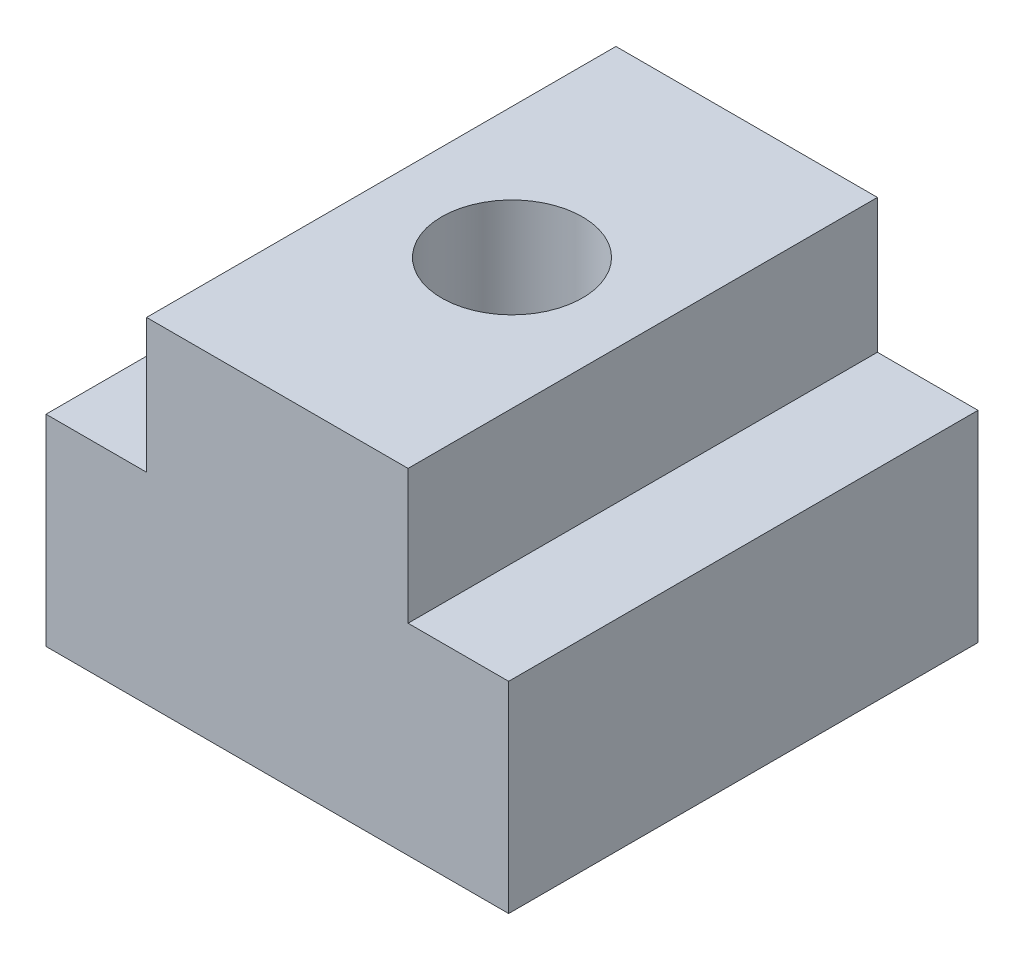
ISO-10303-21;
HEADER;
FILE_DESCRIPTION(('STEP AP214'),'2;1');
FILE_NAME('part.step','',(''),(''),'','','');
FILE_SCHEMA(('AUTOMOTIVE_DESIGN { 1 0 10303 214 1 1 1 1 }'));
ENDSEC;
DATA;
#1=APPLICATION_CONTEXT('core data for automotive mechanical design processes');
#2=APPLICATION_PROTOCOL_DEFINITION('international standard','automotive_design',2000,#1);
#3=PRODUCT_CONTEXT('',#1,'mechanical');
#4=PRODUCT('Part','Part','',(#3));
#5=PRODUCT_RELATED_PRODUCT_CATEGORY('part','',(#4));
#6=PRODUCT_DEFINITION_FORMATION('','',#4);
#7=PRODUCT_DEFINITION_CONTEXT('part definition',#1,'design');
#8=PRODUCT_DEFINITION('design','',#6,#7);
#9=PRODUCT_DEFINITION_SHAPE('','',#8);
#10=(LENGTH_UNIT() NAMED_UNIT(*) SI_UNIT(.MILLI.,.METRE.));
#11=(NAMED_UNIT(*) PLANE_ANGLE_UNIT() SI_UNIT($,.RADIAN.));
#12=(NAMED_UNIT(*) SI_UNIT($,.STERADIAN.) SOLID_ANGLE_UNIT());
#13=UNCERTAINTY_MEASURE_WITH_UNIT(LENGTH_MEASURE(1.E-05),#10,'distance_accuracy_value','');
#14=(GEOMETRIC_REPRESENTATION_CONTEXT(3) GLOBAL_UNCERTAINTY_ASSIGNED_CONTEXT((#13)) GLOBAL_UNIT_ASSIGNED_CONTEXT((#10,
#11,#12)) REPRESENTATION_CONTEXT('',''));
#15=CARTESIAN_POINT('',(0.,0.,0.));
#16=DIRECTION('',(0.,0.,1.));
#17=DIRECTION('',(1.,0.,0.));
#18=AXIS2_PLACEMENT_3D('',#15,#16,#17);
#19=CARTESIAN_POINT('',(0.,6.,14.));
#20=DIRECTION('',(0.,-1.,0.));
#21=DIRECTION('',(0.,0.,-1.));
#22=AXIS2_PLACEMENT_3D('',#19,#20,#21);
#23=PLANE('',#22);
#24=DIRECTION('',(0.,0.,1.));
#25=VECTOR('',#24,1.);
#26=CARTESIAN_POINT('',(3.,6.,0.));
#27=LINE('',#26,#25);
#28=CARTESIAN_POINT('',(3.,6.,0.));
#29=VERTEX_POINT('',#28);
#30=CARTESIAN_POINT('',(3.,6.,14.));
#31=VERTEX_POINT('',#30);
#32=EDGE_CURVE('E110',#29,#31,#27,.T.);
#33=ORIENTED_EDGE('',*,*,#32,.F.);
#34=DIRECTION('',(-1.,0.,0.));
#35=VECTOR('',#34,1.);
#36=CARTESIAN_POINT('',(0.,6.,0.));
#37=LINE('',#36,#35);
#38=CARTESIAN_POINT('',(0.,6.,0.));
#39=VERTEX_POINT('',#38);
#40=EDGE_CURVE('E79',#29,#39,#37,.T.);
#41=ORIENTED_EDGE('',*,*,#40,.T.);
#42=DIRECTION('',(0.,0.,-1.));
#43=VECTOR('',#42,1.);
#44=CARTESIAN_POINT('',(0.,6.,14.));
#45=LINE('',#44,#43);
#46=CARTESIAN_POINT('',(0.,6.,14.));
#47=VERTEX_POINT('',#46);
#48=EDGE_CURVE('E134',#47,#39,#45,.T.);
#49=ORIENTED_EDGE('',*,*,#48,.F.);
#50=DIRECTION('',(-1.,0.,0.));
#51=VECTOR('',#50,1.);
#52=CARTESIAN_POINT('',(0.,6.,14.));
#53=LINE('',#52,#51);
#54=EDGE_CURVE('E57',#31,#47,#53,.T.);
#55=ORIENTED_EDGE('',*,*,#54,.F.);
#56=EDGE_LOOP('',(#33,#41,#49,#55));
#57=FACE_BOUND('',#56,.T.);
#58=ADVANCED_FACE('F33',(#57),#23,.F.);
#59=CARTESIAN_POINT('',(0.,0.,14.));
#60=DIRECTION('',(1.,0.,0.));
#61=DIRECTION('',(0.,0.,-1.));
#62=AXIS2_PLACEMENT_3D('',#59,#60,#61);
#63=PLANE('',#62);
#64=DIRECTION('',(0.,-1.,0.));
#65=VECTOR('',#64,1.);
#66=CARTESIAN_POINT('',(0.,0.,0.));
#67=LINE('',#66,#65);
#68=CARTESIAN_POINT('',(0.,0.,0.));
#69=VERTEX_POINT('',#68);
#70=EDGE_CURVE('E124',#39,#69,#67,.T.);
#71=ORIENTED_EDGE('',*,*,#70,.T.);
#72=DIRECTION('',(0.,0.,-1.));
#73=VECTOR('',#72,1.);
#74=CARTESIAN_POINT('',(0.,0.,14.));
#75=LINE('',#74,#73);
#76=CARTESIAN_POINT('',(0.,0.,14.));
#77=VERTEX_POINT('',#76);
#78=EDGE_CURVE('E11',#77,#69,#75,.T.);
#79=ORIENTED_EDGE('',*,*,#78,.F.);
#80=DIRECTION('',(0.,-1.,0.));
#81=VECTOR('',#80,1.);
#82=CARTESIAN_POINT('',(0.,0.,14.));
#83=LINE('',#82,#81);
#84=EDGE_CURVE('E129',#47,#77,#83,.T.);
#85=ORIENTED_EDGE('',*,*,#84,.F.);
#86=ORIENTED_EDGE('',*,*,#48,.T.);
#87=EDGE_LOOP('',(#71,#79,#85,#86));
#88=FACE_BOUND('',#87,.T.);
#89=ADVANCED_FACE('F35',(#88),#63,.F.);
#90=CARTESIAN_POINT('',(0.,0.,14.));
#91=DIRECTION('',(0.,1.,0.));
#92=DIRECTION('',(0.,0.,1.));
#93=AXIS2_PLACEMENT_3D('',#90,#91,#92);
#94=PLANE('',#93);
#95=CARTESIAN_POINT('',(6.9,0.,7.));
#96=DIRECTION('',(0.,1.,0.));
#97=DIRECTION('',(-1.,0.,0.));
#98=AXIS2_PLACEMENT_3D('',#95,#96,#97);
#99=CIRCLE('',#98,2.1);
#100=CARTESIAN_POINT('',(4.8,0.,7.));
#101=VERTEX_POINT('',#100);
#102=EDGE_CURVE('E172',#101,#101,#99,.T.);
#103=ORIENTED_EDGE('',*,*,#102,.T.);
#104=EDGE_LOOP('',(#103));
#105=FACE_BOUND('',#104,.T.);
#106=DIRECTION('',(1.,0.,0.));
#107=VECTOR('',#106,1.);
#108=CARTESIAN_POINT('',(0.,0.,0.));
#109=LINE('',#108,#107);
#110=CARTESIAN_POINT('',(13.8,0.,0.));
#111=VERTEX_POINT('',#110);
#112=EDGE_CURVE('E130',#69,#111,#109,.T.);
#113=ORIENTED_EDGE('',*,*,#112,.T.);
#114=DIRECTION('',(0.,0.,-1.));
#115=VECTOR('',#114,1.);
#116=CARTESIAN_POINT('',(13.8,0.,14.));
#117=LINE('',#116,#115);
#118=CARTESIAN_POINT('',(13.8,0.,14.));
#119=VERTEX_POINT('',#118);
#120=EDGE_CURVE('E41',#119,#111,#117,.T.);
#121=ORIENTED_EDGE('',*,*,#120,.F.);
#122=DIRECTION('',(1.,0.,0.));
#123=VECTOR('',#122,1.);
#124=CARTESIAN_POINT('',(0.,0.,14.));
#125=LINE('',#124,#123);
#126=EDGE_CURVE('E86',#77,#119,#125,.T.);
#127=ORIENTED_EDGE('',*,*,#126,.F.);
#128=ORIENTED_EDGE('',*,*,#78,.T.);
#129=EDGE_LOOP('',(#113,#121,#127,#128));
#130=FACE_BOUND('',#129,.T.);
#131=ADVANCED_FACE('F157',(#105,#130),#94,.F.);
#132=CARTESIAN_POINT('',(13.8,0.,14.));
#133=DIRECTION('',(-1.,0.,0.));
#134=DIRECTION('',(0.,0.,1.));
#135=AXIS2_PLACEMENT_3D('',#132,#133,#134);
#136=PLANE('',#135);
#137=DIRECTION('',(0.,1.,0.));
#138=VECTOR('',#137,1.);
#139=CARTESIAN_POINT('',(13.8,0.,0.));
#140=LINE('',#139,#138);
#141=CARTESIAN_POINT('',(13.8,6.,0.));
#142=VERTEX_POINT('',#141);
#143=EDGE_CURVE('E126',#111,#142,#140,.T.);
#144=ORIENTED_EDGE('',*,*,#143,.T.);
#145=DIRECTION('',(0.,0.,-1.));
#146=VECTOR('',#145,1.);
#147=CARTESIAN_POINT('',(13.8,6.,14.));
#148=LINE('',#147,#146);
#149=CARTESIAN_POINT('',(13.8,6.,14.));
#150=VERTEX_POINT('',#149);
#151=EDGE_CURVE('E136',#150,#142,#148,.T.);
#152=ORIENTED_EDGE('',*,*,#151,.F.);
#153=DIRECTION('',(0.,1.,0.));
#154=VECTOR('',#153,1.);
#155=CARTESIAN_POINT('',(13.8,0.,14.));
#156=LINE('',#155,#154);
#157=EDGE_CURVE('E145',#119,#150,#156,.T.);
#158=ORIENTED_EDGE('',*,*,#157,.F.);
#159=ORIENTED_EDGE('',*,*,#120,.T.);
#160=EDGE_LOOP('',(#144,#152,#158,#159));
#161=FACE_BOUND('',#160,.T.);
#162=ADVANCED_FACE('F143',(#161),#136,.F.);
#163=CARTESIAN_POINT('',(10.8,6.,0.));
#164=VERTEX_POINT('',#163);
#165=EDGE_CURVE('E125',#142,#164,#37,.T.);
#166=ORIENTED_EDGE('',*,*,#165,.T.);
#167=DIRECTION('',(0.,0.,1.));
#168=VECTOR('',#167,1.);
#169=CARTESIAN_POINT('',(10.8,6.,0.));
#170=LINE('',#169,#168);
#171=CARTESIAN_POINT('',(10.8,6.,14.));
#172=VERTEX_POINT('',#171);
#173=EDGE_CURVE('E118',#164,#172,#170,.T.);
#174=ORIENTED_EDGE('',*,*,#173,.T.);
#175=EDGE_CURVE('E137',#150,#172,#53,.T.);
#176=ORIENTED_EDGE('',*,*,#175,.F.);
#177=ORIENTED_EDGE('',*,*,#151,.T.);
#178=EDGE_LOOP('',(#166,#174,#176,#177));
#179=FACE_BOUND('',#178,.T.);
#180=ADVANCED_FACE('F150',(#179),#23,.F.);
#181=CARTESIAN_POINT('',(0.,0.,14.));
#182=DIRECTION('',(0.,0.,-1.));
#183=DIRECTION('',(-1.,0.,0.));
#184=AXIS2_PLACEMENT_3D('',#181,#182,#183);
#185=PLANE('',#184);
#186=ORIENTED_EDGE('',*,*,#84,.T.);
#187=ORIENTED_EDGE('',*,*,#126,.T.);
#188=ORIENTED_EDGE('',*,*,#157,.T.);
#189=ORIENTED_EDGE('',*,*,#175,.T.);
#190=DIRECTION('',(0.,1.,0.));
#191=VECTOR('',#190,1.);
#192=CARTESIAN_POINT('',(10.8,6.,14.));
#193=LINE('',#192,#191);
#194=CARTESIAN_POINT('',(10.8,10.,14.));
#195=VERTEX_POINT('',#194);
#196=EDGE_CURVE('E48',#172,#195,#193,.T.);
#197=ORIENTED_EDGE('',*,*,#196,.T.);
#198=DIRECTION('',(-1.,0.,0.));
#199=VECTOR('',#198,1.);
#200=CARTESIAN_POINT('',(3.,10.,14.));
#201=LINE('',#200,#199);
#202=CARTESIAN_POINT('',(3.,10.,14.));
#203=VERTEX_POINT('',#202);
#204=EDGE_CURVE('E116',#195,#203,#201,.T.);
#205=ORIENTED_EDGE('',*,*,#204,.T.);
#206=DIRECTION('',(0.,-1.,0.));
#207=VECTOR('',#206,1.);
#208=CARTESIAN_POINT('',(3.,6.,14.));
#209=LINE('',#208,#207);
#210=EDGE_CURVE('E170',#203,#31,#209,.T.);
#211=ORIENTED_EDGE('',*,*,#210,.T.);
#212=ORIENTED_EDGE('',*,*,#54,.T.);
#213=EDGE_LOOP('',(#186,#187,#188,#189,#197,#205,#211,#212));
#214=FACE_BOUND('',#213,.T.);
#215=ADVANCED_FACE('F194',(#214),#185,.F.);
#216=CARTESIAN_POINT('',(0.,0.,0.));
#217=DIRECTION('',(0.,0.,-1.));
#218=DIRECTION('',(-1.,0.,0.));
#219=AXIS2_PLACEMENT_3D('',#216,#217,#218);
#220=PLANE('',#219);
#221=ORIENTED_EDGE('',*,*,#70,.F.);
#222=ORIENTED_EDGE('',*,*,#40,.F.);
#223=DIRECTION('',(0.,-1.,0.));
#224=VECTOR('',#223,1.);
#225=CARTESIAN_POINT('',(3.,6.,0.));
#226=LINE('',#225,#224);
#227=CARTESIAN_POINT('',(3.,10.,0.));
#228=VERTEX_POINT('',#227);
#229=EDGE_CURVE('E107',#228,#29,#226,.T.);
#230=ORIENTED_EDGE('',*,*,#229,.F.);
#231=DIRECTION('',(-1.,0.,0.));
#232=VECTOR('',#231,1.);
#233=CARTESIAN_POINT('',(3.,10.,0.));
#234=LINE('',#233,#232);
#235=CARTESIAN_POINT('',(10.8,10.,0.));
#236=VERTEX_POINT('',#235);
#237=EDGE_CURVE('E119',#236,#228,#234,.T.);
#238=ORIENTED_EDGE('',*,*,#237,.F.);
#239=DIRECTION('',(0.,1.,0.));
#240=VECTOR('',#239,1.);
#241=CARTESIAN_POINT('',(10.8,6.,0.));
#242=LINE('',#241,#240);
#243=EDGE_CURVE('E115',#164,#236,#242,.T.);
#244=ORIENTED_EDGE('',*,*,#243,.F.);
#245=ORIENTED_EDGE('',*,*,#165,.F.);
#246=ORIENTED_EDGE('',*,*,#143,.F.);
#247=ORIENTED_EDGE('',*,*,#112,.F.);
#248=EDGE_LOOP('',(#221,#222,#230,#238,#244,#245,#246,#247));
#249=FACE_BOUND('',#248,.T.);
#250=ADVANCED_FACE('F122',(#249),#220,.T.);
#251=CARTESIAN_POINT('',(3.,6.,0.));
#252=DIRECTION('',(-1.,0.,0.));
#253=DIRECTION('',(0.,-1.,0.));
#254=AXIS2_PLACEMENT_3D('',#251,#252,#253);
#255=PLANE('',#254);
#256=ORIENTED_EDGE('',*,*,#210,.F.);
#257=DIRECTION('',(0.,0.,1.));
#258=VECTOR('',#257,1.);
#259=CARTESIAN_POINT('',(3.,10.,0.));
#260=LINE('',#259,#258);
#261=EDGE_CURVE('E111',#228,#203,#260,.T.);
#262=ORIENTED_EDGE('',*,*,#261,.F.);
#263=ORIENTED_EDGE('',*,*,#229,.T.);
#264=ORIENTED_EDGE('',*,*,#32,.T.);
#265=EDGE_LOOP('',(#256,#262,#263,#264));
#266=FACE_BOUND('',#265,.T.);
#267=ADVANCED_FACE('F109',(#266),#255,.T.);
#268=CARTESIAN_POINT('',(3.,10.,0.));
#269=DIRECTION('',(0.,1.,0.));
#270=DIRECTION('',(-1.,0.,0.));
#271=AXIS2_PLACEMENT_3D('',#268,#269,#270);
#272=PLANE('',#271);
#273=CARTESIAN_POINT('',(6.9,10.,7.));
#274=DIRECTION('',(0.,1.,0.));
#275=DIRECTION('',(-1.,0.,0.));
#276=AXIS2_PLACEMENT_3D('',#273,#274,#275);
#277=CIRCLE('',#276,2.1);
#278=CARTESIAN_POINT('',(4.8,10.,7.));
#279=VERTEX_POINT('',#278);
#280=EDGE_CURVE('E175',#279,#279,#277,.T.);
#281=ORIENTED_EDGE('',*,*,#280,.F.);
#282=EDGE_LOOP('',(#281));
#283=FACE_BOUND('',#282,.T.);
#284=ORIENTED_EDGE('',*,*,#204,.F.);
#285=DIRECTION('',(0.,0.,1.));
#286=VECTOR('',#285,1.);
#287=CARTESIAN_POINT('',(10.8,10.,0.));
#288=LINE('',#287,#286);
#289=EDGE_CURVE('E164',#236,#195,#288,.T.);
#290=ORIENTED_EDGE('',*,*,#289,.F.);
#291=ORIENTED_EDGE('',*,*,#237,.T.);
#292=ORIENTED_EDGE('',*,*,#261,.T.);
#293=EDGE_LOOP('',(#284,#290,#291,#292));
#294=FACE_BOUND('',#293,.T.);
#295=ADVANCED_FACE('F189',(#283,#294),#272,.T.);
#296=CARTESIAN_POINT('',(10.8,6.,0.));
#297=DIRECTION('',(1.,0.,0.));
#298=DIRECTION('',(0.,0.,-1.));
#299=AXIS2_PLACEMENT_3D('',#296,#297,#298);
#300=PLANE('',#299);
#301=ORIENTED_EDGE('',*,*,#196,.F.);
#302=ORIENTED_EDGE('',*,*,#173,.F.);
#303=ORIENTED_EDGE('',*,*,#243,.T.);
#304=ORIENTED_EDGE('',*,*,#289,.T.);
#305=EDGE_LOOP('',(#301,#302,#303,#304));
#306=FACE_BOUND('',#305,.T.);
#307=ADVANCED_FACE('F185',(#306),#300,.T.);
#308=CARTESIAN_POINT('',(6.9,0.,7.));
#309=DIRECTION('',(0.,1.,0.));
#310=DIRECTION('',(-1.,0.,0.));
#311=AXIS2_PLACEMENT_3D('',#308,#309,#310);
#312=CYLINDRICAL_SURFACE('',#311,2.1);
#313=CARTESIAN_POINT('',(4.8,0.,7.));
#314=CARTESIAN_POINT('',(4.8,0.104166666666664,7.));
#315=CARTESIAN_POINT('',(4.8,0.208333333333331,7.));
#316=CARTESIAN_POINT('',(4.8,0.416666666666665,7.));
#317=CARTESIAN_POINT('',(4.8,0.520833333333331,7.));
#318=CARTESIAN_POINT('',(4.8,0.729166666666665,7.));
#319=CARTESIAN_POINT('',(4.8,0.833333333333332,7.));
#320=CARTESIAN_POINT('',(4.8,1.04166666666666,7.));
#321=CARTESIAN_POINT('',(4.8,1.14583333333333,7.));
#322=CARTESIAN_POINT('',(4.8,1.35416666666666,7.));
#323=CARTESIAN_POINT('',(4.8,1.45833333333333,7.));
#324=CARTESIAN_POINT('',(4.8,1.66666666666667,7.));
#325=CARTESIAN_POINT('',(4.8,1.77083333333333,7.));
#326=CARTESIAN_POINT('',(4.8,1.97916666666667,7.));
#327=CARTESIAN_POINT('',(4.8,2.08333333333333,7.));
#328=CARTESIAN_POINT('',(4.8,2.29166666666667,7.));
#329=CARTESIAN_POINT('',(4.8,2.39583333333333,7.));
#330=CARTESIAN_POINT('',(4.8,2.60416666666667,7.));
#331=CARTESIAN_POINT('',(4.8,2.70833333333333,7.));
#332=CARTESIAN_POINT('',(4.8,2.91666666666667,7.));
#333=CARTESIAN_POINT('',(4.8,3.02083333333333,7.));
#334=CARTESIAN_POINT('',(4.8,3.22916666666667,7.));
#335=CARTESIAN_POINT('',(4.8,3.33333333333333,7.));
#336=CARTESIAN_POINT('',(4.8,3.54166666666667,7.));
#337=CARTESIAN_POINT('',(4.8,3.64583333333333,7.));
#338=CARTESIAN_POINT('',(4.8,3.85416666666667,7.));
#339=CARTESIAN_POINT('',(4.8,3.95833333333333,7.));
#340=CARTESIAN_POINT('',(4.8,4.16666666666667,7.));
#341=CARTESIAN_POINT('',(4.8,4.27083333333333,7.));
#342=CARTESIAN_POINT('',(4.8,4.47916666666667,7.));
#343=CARTESIAN_POINT('',(4.8,4.58333333333333,7.));
#344=CARTESIAN_POINT('',(4.8,4.79166666666667,7.));
#345=CARTESIAN_POINT('',(4.8,4.89583333333333,7.));
#346=CARTESIAN_POINT('',(4.8,5.10416666666667,7.));
#347=CARTESIAN_POINT('',(4.8,5.20833333333333,7.));
#348=CARTESIAN_POINT('',(4.8,5.41666666666667,7.));
#349=CARTESIAN_POINT('',(4.8,5.52083333333333,7.));
#350=CARTESIAN_POINT('',(4.8,5.72916666666667,7.));
#351=CARTESIAN_POINT('',(4.8,5.83333333333333,7.));
#352=CARTESIAN_POINT('',(4.8,6.04166666666667,7.));
#353=CARTESIAN_POINT('',(4.8,6.14583333333333,7.));
#354=CARTESIAN_POINT('',(4.8,6.35416666666667,7.));
#355=CARTESIAN_POINT('',(4.8,6.45833333333333,7.));
#356=CARTESIAN_POINT('',(4.8,6.66666666666667,7.));
#357=CARTESIAN_POINT('',(4.8,6.77083333333333,7.));
#358=CARTESIAN_POINT('',(4.8,6.97916666666667,7.));
#359=CARTESIAN_POINT('',(4.8,7.08333333333333,7.));
#360=CARTESIAN_POINT('',(4.8,7.29166666666667,7.));
#361=CARTESIAN_POINT('',(4.8,7.39583333333333,7.));
#362=CARTESIAN_POINT('',(4.8,7.60416666666667,7.));
#363=CARTESIAN_POINT('',(4.8,7.70833333333333,7.));
#364=CARTESIAN_POINT('',(4.8,7.91666666666667,7.));
#365=CARTESIAN_POINT('',(4.8,8.02083333333333,7.));
#366=CARTESIAN_POINT('',(4.8,8.22916666666667,7.));
#367=CARTESIAN_POINT('',(4.8,8.33333333333333,7.));
#368=CARTESIAN_POINT('',(4.8,8.54166666666667,7.));
#369=CARTESIAN_POINT('',(4.8,8.64583333333333,7.));
#370=CARTESIAN_POINT('',(4.8,8.85416666666667,7.));
#371=CARTESIAN_POINT('',(4.8,8.95833333333333,7.));
#372=CARTESIAN_POINT('',(4.8,9.16666666666667,7.));
#373=CARTESIAN_POINT('',(4.8,9.27083333333333,7.));
#374=CARTESIAN_POINT('',(4.8,9.47916666666667,7.));
#375=CARTESIAN_POINT('',(4.8,9.58333333333333,7.));
#376=CARTESIAN_POINT('',(4.8,9.79166666666667,7.));
#377=CARTESIAN_POINT('',(4.8,9.89583333333333,7.));
#378=CARTESIAN_POINT('',(4.8,10.,7.));
#379=B_SPLINE_CURVE_WITH_KNOTS('',3,(#313,#314,#315,#316,#317,#318,#319,#320,#321,#322,#323,
#324,#325,#326,#327,#328,#329,#330,#331,#332,#333,#334,#335,#336,#337,#338,#339,#340,#341,#342,
#343,#344,#345,#346,#347,#348,#349,#350,#351,#352,#353,#354,#355,#356,#357,#358,#359,#360,#361,
#362,#363,#364,#365,#366,#367,#368,#369,#370,#371,#372,#373,#374,#375,#376,#377,#378),
.UNSPECIFIED.,.F.,.F.,(4,2,2,2,2,2,2,2,2,2,2,2,2,2,2,2,2,2,2,2,2,2,2,2,2,2,2,2,2,2,2,2,4),(0.,
0.3125,0.625,0.937500000000001,1.25,1.5625,1.875,2.1875,2.5,2.8125,3.125,3.4375,3.75,4.0625,
4.375,4.6875,5.,5.3125,5.625,5.9375,6.25,6.5625,6.875,7.1875,7.5,7.8125,8.125,8.4375,8.75,
9.06250000000001,9.37500000000001,9.68750000000001,10.),.UNSPECIFIED.);
#380=EDGE_CURVE('BSEAM182',#101,#279,#379,.T.);
#381=ORIENTED_EDGE('',*,*,#102,.F.);
#382=ORIENTED_EDGE('',*,*,#280,.T.);
#383=ORIENTED_EDGE('',*,*,#380,.T.);
#384=ORIENTED_EDGE('',*,*,#380,.F.);
#385=EDGE_LOOP('',(#381,#383,#382,#384));
#386=FACE_BOUND('',#385,.T.);
#387=ADVANCED_FACE('F182',(#386),#312,.F.);
#388=CLOSED_SHELL('',(#58,#89,#131,#162,#180,#215,#250,#267,#295,#307,#387));
#389=MANIFOLD_SOLID_BREP('B2',#388);
#390=ADVANCED_BREP_SHAPE_REPRESENTATION('',(#18,#389),#14);
#391=SHAPE_DEFINITION_REPRESENTATION(#9,#390);
ENDSEC;
END-ISO-10303-21;
